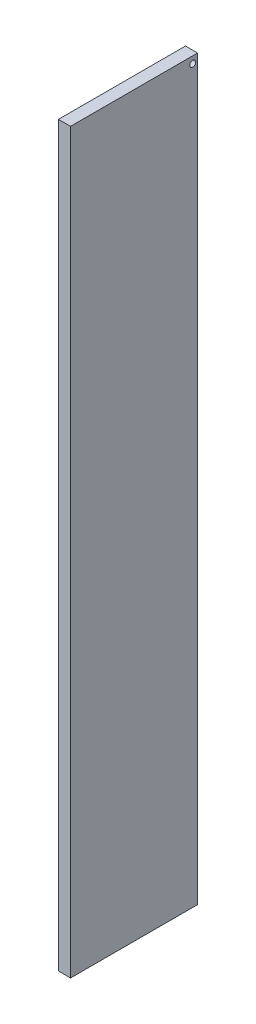
ISO-10303-21;
HEADER;
FILE_DESCRIPTION(('STEP AP214'),'2;1');
FILE_NAME('part.step','',(''),(''),'','','');
FILE_SCHEMA(('AUTOMOTIVE_DESIGN { 1 0 10303 214 1 1 1 1 }'));
ENDSEC;
DATA;
#1=APPLICATION_CONTEXT('core data for automotive mechanical design processes');
#2=APPLICATION_PROTOCOL_DEFINITION('international standard','automotive_design',2000,#1);
#3=PRODUCT_CONTEXT('',#1,'mechanical');
#4=PRODUCT('Part','Part','',(#3));
#5=PRODUCT_RELATED_PRODUCT_CATEGORY('part','',(#4));
#6=PRODUCT_DEFINITION_FORMATION('','',#4);
#7=PRODUCT_DEFINITION_CONTEXT('part definition',#1,'design');
#8=PRODUCT_DEFINITION('design','',#6,#7);
#9=PRODUCT_DEFINITION_SHAPE('','',#8);
#10=(LENGTH_UNIT() NAMED_UNIT(*) SI_UNIT(.MILLI.,.METRE.));
#11=(NAMED_UNIT(*) PLANE_ANGLE_UNIT() SI_UNIT($,.RADIAN.));
#12=(NAMED_UNIT(*) SI_UNIT($,.STERADIAN.) SOLID_ANGLE_UNIT());
#13=UNCERTAINTY_MEASURE_WITH_UNIT(LENGTH_MEASURE(1.E-05),#10,'distance_accuracy_value','');
#14=(GEOMETRIC_REPRESENTATION_CONTEXT(3) GLOBAL_UNCERTAINTY_ASSIGNED_CONTEXT((#13)) GLOBAL_UNIT_ASSIGNED_CONTEXT((#10,
#11,#12)) REPRESENTATION_CONTEXT('',''));
#15=CARTESIAN_POINT('',(0.,0.,0.));
#16=DIRECTION('',(0.,0.,1.));
#17=DIRECTION('',(1.,0.,0.));
#18=AXIS2_PLACEMENT_3D('',#15,#16,#17);
#19=CARTESIAN_POINT('',(6.35,193.548,-33.3375));
#20=DIRECTION('',(0.,0.,1.));
#21=DIRECTION('',(0.,-1.,0.));
#22=AXIS2_PLACEMENT_3D('',#19,#20,#21);
#23=PLANE('',#22);
#24=DIRECTION('',(0.,1.,0.));
#25=VECTOR('',#24,1.);
#26=CARTESIAN_POINT('',(0.,193.548,-33.3375));
#27=LINE('',#26,#25);
#28=CARTESIAN_POINT('',(0.,-193.548,-33.3375));
#29=VERTEX_POINT('',#28);
#30=CARTESIAN_POINT('',(0.,193.548,-33.3375));
#31=VERTEX_POINT('',#30);
#32=EDGE_CURVE('E96',#29,#31,#27,.T.);
#33=ORIENTED_EDGE('',*,*,#32,.T.);
#34=DIRECTION('',(-1.,0.,0.));
#35=VECTOR('',#34,1.);
#36=CARTESIAN_POINT('',(6.35,193.548,-33.3375));
#37=LINE('',#36,#35);
#38=CARTESIAN_POINT('',(6.35,193.548,-33.3375));
#39=VERTEX_POINT('',#38);
#40=EDGE_CURVE('E11',#39,#31,#37,.T.);
#41=ORIENTED_EDGE('',*,*,#40,.F.);
#42=DIRECTION('',(0.,1.,0.));
#43=VECTOR('',#42,1.);
#44=CARTESIAN_POINT('',(6.35,193.548,-33.3375));
#45=LINE('',#44,#43);
#46=CARTESIAN_POINT('',(6.35,-193.548,-33.3375));
#47=VERTEX_POINT('',#46);
#48=EDGE_CURVE('E84',#47,#39,#45,.T.);
#49=ORIENTED_EDGE('',*,*,#48,.F.);
#50=DIRECTION('',(-1.,0.,0.));
#51=VECTOR('',#50,1.);
#52=CARTESIAN_POINT('',(6.35,-193.548,-33.3375));
#53=LINE('',#52,#51);
#54=EDGE_CURVE('E92',#47,#29,#53,.T.);
#55=ORIENTED_EDGE('',*,*,#54,.T.);
#56=EDGE_LOOP('',(#33,#41,#49,#55));
#57=FACE_BOUND('',#56,.T.);
#58=ADVANCED_FACE('F33',(#57),#23,.F.);
#59=CARTESIAN_POINT('',(6.35,193.548,33.3375));
#60=DIRECTION('',(0.,-1.,0.));
#61=DIRECTION('',(0.,0.,-1.));
#62=AXIS2_PLACEMENT_3D('',#59,#60,#61);
#63=PLANE('',#62);
#64=DIRECTION('',(0.,0.,1.));
#65=VECTOR('',#64,1.);
#66=CARTESIAN_POINT('',(0.,193.548,33.3375));
#67=LINE('',#66,#65);
#68=CARTESIAN_POINT('',(0.,193.548,33.3375));
#69=VERTEX_POINT('',#68);
#70=EDGE_CURVE('E88',#31,#69,#67,.T.);
#71=ORIENTED_EDGE('',*,*,#70,.T.);
#72=DIRECTION('',(-1.,0.,0.));
#73=VECTOR('',#72,1.);
#74=CARTESIAN_POINT('',(6.35,193.548,33.3375));
#75=LINE('',#74,#73);
#76=CARTESIAN_POINT('',(6.35,193.548,33.3375));
#77=VERTEX_POINT('',#76);
#78=EDGE_CURVE('E41',#77,#69,#75,.T.);
#79=ORIENTED_EDGE('',*,*,#78,.F.);
#80=DIRECTION('',(0.,0.,1.));
#81=VECTOR('',#80,1.);
#82=CARTESIAN_POINT('',(6.35,193.548,33.3375));
#83=LINE('',#82,#81);
#84=EDGE_CURVE('E79',#39,#77,#83,.T.);
#85=ORIENTED_EDGE('',*,*,#84,.F.);
#86=ORIENTED_EDGE('',*,*,#40,.T.);
#87=EDGE_LOOP('',(#71,#79,#85,#86));
#88=FACE_BOUND('',#87,.T.);
#89=ADVANCED_FACE('F87',(#88),#63,.F.);
#90=CARTESIAN_POINT('',(6.35,193.548,33.3375));
#91=DIRECTION('',(0.,0.,-1.));
#92=DIRECTION('',(0.,1.,0.));
#93=AXIS2_PLACEMENT_3D('',#90,#91,#92);
#94=PLANE('',#93);
#95=DIRECTION('',(0.,-1.,0.));
#96=VECTOR('',#95,1.);
#97=CARTESIAN_POINT('',(0.,193.548,33.3375));
#98=LINE('',#97,#96);
#99=CARTESIAN_POINT('',(0.,-193.548,33.3375));
#100=VERTEX_POINT('',#99);
#101=EDGE_CURVE('E66',#69,#100,#98,.T.);
#102=ORIENTED_EDGE('',*,*,#101,.T.);
#103=DIRECTION('',(-1.,0.,0.));
#104=VECTOR('',#103,1.);
#105=CARTESIAN_POINT('',(6.35,-193.548,33.3375));
#106=LINE('',#105,#104);
#107=CARTESIAN_POINT('',(6.35,-193.548,33.3375));
#108=VERTEX_POINT('',#107);
#109=EDGE_CURVE('E89',#108,#100,#106,.T.);
#110=ORIENTED_EDGE('',*,*,#109,.F.);
#111=DIRECTION('',(0.,-1.,0.));
#112=VECTOR('',#111,1.);
#113=CARTESIAN_POINT('',(6.35,193.548,33.3375));
#114=LINE('',#113,#112);
#115=EDGE_CURVE('E82',#77,#108,#114,.T.);
#116=ORIENTED_EDGE('',*,*,#115,.F.);
#117=ORIENTED_EDGE('',*,*,#78,.T.);
#118=EDGE_LOOP('',(#102,#110,#116,#117));
#119=FACE_BOUND('',#118,.T.);
#120=ADVANCED_FACE('F90',(#119),#94,.F.);
#121=CARTESIAN_POINT('',(6.35,-193.548,33.3375));
#122=DIRECTION('',(0.,1.,0.));
#123=DIRECTION('',(0.,0.,1.));
#124=AXIS2_PLACEMENT_3D('',#121,#122,#123);
#125=PLANE('',#124);
#126=DIRECTION('',(0.,0.,-1.));
#127=VECTOR('',#126,1.);
#128=CARTESIAN_POINT('',(0.,-193.548,33.3375));
#129=LINE('',#128,#127);
#130=EDGE_CURVE('E72',#100,#29,#129,.T.);
#131=ORIENTED_EDGE('',*,*,#130,.T.);
#132=ORIENTED_EDGE('',*,*,#54,.F.);
#133=DIRECTION('',(0.,0.,-1.));
#134=VECTOR('',#133,1.);
#135=CARTESIAN_POINT('',(6.35,-193.548,33.3375));
#136=LINE('',#135,#134);
#137=EDGE_CURVE('E49',#108,#47,#136,.T.);
#138=ORIENTED_EDGE('',*,*,#137,.F.);
#139=ORIENTED_EDGE('',*,*,#109,.T.);
#140=EDGE_LOOP('',(#131,#132,#138,#139));
#141=FACE_BOUND('',#140,.T.);
#142=ADVANCED_FACE('F104',(#141),#125,.F.);
#143=CARTESIAN_POINT('',(6.35,0.,0.));
#144=DIRECTION('',(1.,0.,0.));
#145=DIRECTION('',(0.,0.,-1.));
#146=AXIS2_PLACEMENT_3D('',#143,#144,#145);
#147=PLANE('',#146);
#148=CARTESIAN_POINT('',(6.35,189.929324986736,-30.8166635638827));
#149=DIRECTION('',(1.,0.,0.));
#150=DIRECTION('',(0.,0.,-1.));
#151=AXIS2_PLACEMENT_3D('',#148,#149,#150);
#152=CIRCLE('',#151,1.58750000000001);
#153=CARTESIAN_POINT('',(6.35,189.929324986736,-32.4041635638827));
#154=VERTEX_POINT('',#153);
#155=EDGE_CURVE('E112',#154,#154,#152,.T.);
#156=ORIENTED_EDGE('',*,*,#155,.F.);
#157=EDGE_LOOP('',(#156));
#158=FACE_BOUND('',#157,.T.);
#159=ORIENTED_EDGE('',*,*,#48,.T.);
#160=ORIENTED_EDGE('',*,*,#84,.T.);
#161=ORIENTED_EDGE('',*,*,#115,.T.);
#162=ORIENTED_EDGE('',*,*,#137,.T.);
#163=EDGE_LOOP('',(#159,#160,#161,#162));
#164=FACE_BOUND('',#163,.T.);
#165=ADVANCED_FACE('F80',(#158,#164),#147,.T.);
#166=CARTESIAN_POINT('',(0.,0.,0.));
#167=DIRECTION('',(1.,0.,0.));
#168=DIRECTION('',(0.,0.,-1.));
#169=AXIS2_PLACEMENT_3D('',#166,#167,#168);
#170=PLANE('',#169);
#171=CARTESIAN_POINT('',(0.,189.929324986736,-30.8166635638827));
#172=DIRECTION('',(1.,0.,0.));
#173=DIRECTION('',(0.,0.,-1.));
#174=AXIS2_PLACEMENT_3D('',#171,#172,#173);
#175=CIRCLE('',#174,1.58750000000001);
#176=CARTESIAN_POINT('',(0.,189.929324986736,-32.4041635638827));
#177=VERTEX_POINT('',#176);
#178=EDGE_CURVE('E99',#177,#177,#175,.F.);
#179=ORIENTED_EDGE('',*,*,#178,.F.);
#180=EDGE_LOOP('',(#179));
#181=FACE_BOUND('',#180,.T.);
#182=ORIENTED_EDGE('',*,*,#32,.F.);
#183=ORIENTED_EDGE('',*,*,#130,.F.);
#184=ORIENTED_EDGE('',*,*,#101,.F.);
#185=ORIENTED_EDGE('',*,*,#70,.F.);
#186=EDGE_LOOP('',(#182,#183,#184,#185));
#187=FACE_BOUND('',#186,.T.);
#188=ADVANCED_FACE('F107',(#181,#187),#170,.F.);
#189=CARTESIAN_POINT('',(-0.00100000000000013,189.929324986736,-30.8166635638827));
#190=DIRECTION('',(1.,0.,0.));
#191=DIRECTION('',(0.,0.,-1.));
#192=AXIS2_PLACEMENT_3D('',#189,#190,#191);
#193=CYLINDRICAL_SURFACE('',#192,1.58750000000001);
#194=ORIENTED_EDGE('',*,*,#155,.T.);
#195=EDGE_LOOP('',(#194));
#196=FACE_BOUND('',#195,.T.);
#197=ORIENTED_EDGE('',*,*,#178,.T.);
#198=EDGE_LOOP('',(#197));
#199=FACE_BOUND('',#198,.T.);
#200=ADVANCED_FACE('F116',(#196,#199),#193,.F.);
#201=CLOSED_SHELL('',(#58,#89,#120,#142,#165,#188,#200));
#202=MANIFOLD_SOLID_BREP('B2',#201);
#203=ADVANCED_BREP_SHAPE_REPRESENTATION('',(#18,#202),#14);
#204=SHAPE_DEFINITION_REPRESENTATION(#9,#203);
ENDSEC;
END-ISO-10303-21;
